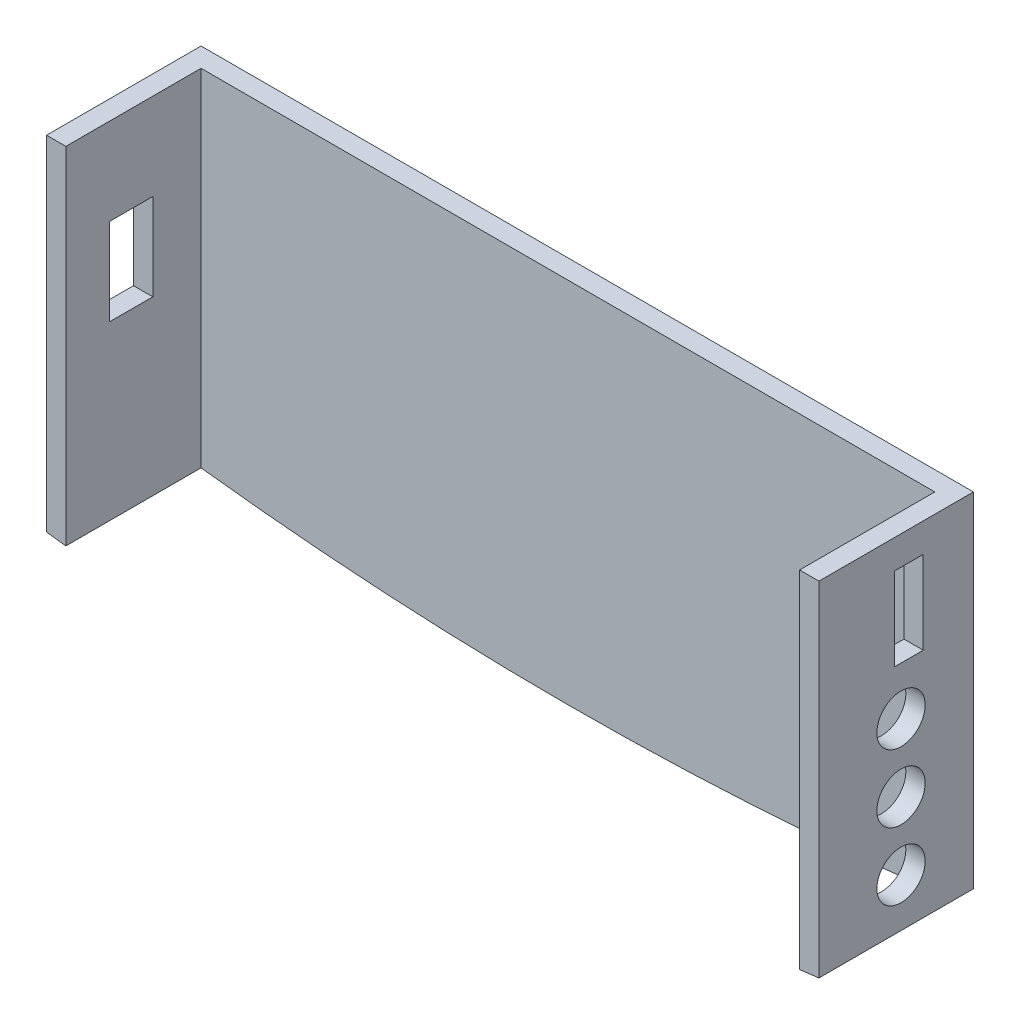
ISO-10303-21;
HEADER;
FILE_DESCRIPTION(('STEP AP214'),'2;1');
FILE_NAME('part.step','',(''),(''),'','','');
FILE_SCHEMA(('AUTOMOTIVE_DESIGN { 1 0 10303 214 1 1 1 1 }'));
ENDSEC;
DATA;
#1=APPLICATION_CONTEXT('core data for automotive mechanical design processes');
#2=APPLICATION_PROTOCOL_DEFINITION('international standard','automotive_design',2000,#1);
#3=PRODUCT_CONTEXT('',#1,'mechanical');
#4=PRODUCT('Part','Part','',(#3));
#5=PRODUCT_RELATED_PRODUCT_CATEGORY('part','',(#4));
#6=PRODUCT_DEFINITION_FORMATION('','',#4);
#7=PRODUCT_DEFINITION_CONTEXT('part definition',#1,'design');
#8=PRODUCT_DEFINITION('design','',#6,#7);
#9=PRODUCT_DEFINITION_SHAPE('','',#8);
#10=(LENGTH_UNIT() NAMED_UNIT(*) SI_UNIT(.MILLI.,.METRE.));
#11=(NAMED_UNIT(*) PLANE_ANGLE_UNIT() SI_UNIT($,.RADIAN.));
#12=(NAMED_UNIT(*) SI_UNIT($,.STERADIAN.) SOLID_ANGLE_UNIT());
#13=UNCERTAINTY_MEASURE_WITH_UNIT(LENGTH_MEASURE(1.E-05),#10,'distance_accuracy_value','');
#14=(GEOMETRIC_REPRESENTATION_CONTEXT(3) GLOBAL_UNCERTAINTY_ASSIGNED_CONTEXT((#13)) GLOBAL_UNIT_ASSIGNED_CONTEXT((#10,
#11,#12)) REPRESENTATION_CONTEXT('',''));
#15=CARTESIAN_POINT('',(0.,0.,0.));
#16=DIRECTION('',(0.,0.,1.));
#17=DIRECTION('',(1.,0.,0.));
#18=AXIS2_PLACEMENT_3D('',#15,#16,#17);
#19=CARTESIAN_POINT('',(0.,0.,16.));
#20=DIRECTION('',(0.,0.,1.));
#21=DIRECTION('',(1.,0.,0.));
#22=AXIS2_PLACEMENT_3D('',#19,#20,#21);
#23=PLANE('',#22);
#24=CARTESIAN_POINT('',(-50.4205664671253,289.986586920608,16.));
#25=DIRECTION('',(0.,0.,1.));
#26=DIRECTION('',(1.,0.,0.));
#27=AXIS2_PLACEMENT_3D('',#24,#25,#26);
#28=CIRCLE('',#27,321.75);
#29=CARTESIAN_POINT('',(-90.4205664671254,-29.2673284821631,16.));
#30=VERTEX_POINT('',#29);
#31=CARTESIAN_POINT('',(-88.4205664671254,-29.5115547015299,16.));
#32=VERTEX_POINT('',#31);
#33=EDGE_CURVE('E318',#30,#32,#28,.T.);
#34=ORIENTED_EDGE('',*,*,#33,.T.);
#35=DIRECTION('',(0.,1.,0.));
#36=VECTOR('',#35,1.);
#37=CARTESIAN_POINT('',(-88.4205664671254,0.,16.));
#38=LINE('',#37,#36);
#39=CARTESIAN_POINT('',(-88.4205664671254,6.33267151783695,16.));
#40=VERTEX_POINT('',#39);
#41=EDGE_CURVE('E300',#32,#40,#38,.T.);
#42=ORIENTED_EDGE('',*,*,#41,.T.);
#43=DIRECTION('',(-1.,0.,0.));
#44=VECTOR('',#43,1.);
#45=CARTESIAN_POINT('',(0.,6.33267151783695,16.));
#46=LINE('',#45,#44);
#47=CARTESIAN_POINT('',(-90.4205664671254,6.33267151783695,16.));
#48=VERTEX_POINT('',#47);
#49=EDGE_CURVE('E325',#40,#48,#46,.T.);
#50=ORIENTED_EDGE('',*,*,#49,.T.);
#51=DIRECTION('',(0.,1.,0.));
#52=VECTOR('',#51,1.);
#53=CARTESIAN_POINT('',(-90.4205664671254,0.,16.));
#54=LINE('',#53,#52);
#55=EDGE_CURVE('E312',#30,#48,#54,.T.);
#56=ORIENTED_EDGE('',*,*,#55,.F.);
#57=EDGE_LOOP('',(#34,#42,#50,#56));
#58=FACE_BOUND('',#57,.T.);
#59=ADVANCED_FACE('F49',(#58),#23,.T.);
#60=CARTESIAN_POINT('',(-90.4205664671254,0.,16.));
#61=DIRECTION('',(-1.,0.,0.));
#62=DIRECTION('',(0.,0.,1.));
#63=AXIS2_PLACEMENT_3D('',#60,#61,#62);
#64=PLANE('',#63);
#65=DIRECTION('',(0.,-1.,0.));
#66=VECTOR('',#65,1.);
#67=CARTESIAN_POINT('',(-90.4205664671254,-2.66732848216305,7.));
#68=LINE('',#67,#66);
#69=CARTESIAN_POINT('',(-90.4205664671254,-2.66732848216305,7.));
#70=VERTEX_POINT('',#69);
#71=CARTESIAN_POINT('',(-90.4205664671254,-11.6673284821631,7.));
#72=VERTEX_POINT('',#71);
#73=EDGE_CURVE('E245',#70,#72,#68,.T.);
#74=ORIENTED_EDGE('',*,*,#73,.F.);
#75=DIRECTION('',(0.,0.,-1.));
#76=VECTOR('',#75,1.);
#77=CARTESIAN_POINT('',(-90.4205664671254,-2.66732848216305,7.));
#78=LINE('',#77,#76);
#79=CARTESIAN_POINT('',(-90.4205664671254,-2.66732848216305,11.5));
#80=VERTEX_POINT('',#79);
#81=EDGE_CURVE('E256',#80,#70,#78,.T.);
#82=ORIENTED_EDGE('',*,*,#81,.F.);
#83=DIRECTION('',(0.,1.,0.));
#84=VECTOR('',#83,1.);
#85=CARTESIAN_POINT('',(-90.4205664671254,-2.66732848216305,11.5));
#86=LINE('',#85,#84);
#87=CARTESIAN_POINT('',(-90.4205664671254,-11.6673284821631,11.5));
#88=VERTEX_POINT('',#87);
#89=EDGE_CURVE('E252',#88,#80,#86,.T.);
#90=ORIENTED_EDGE('',*,*,#89,.F.);
#91=DIRECTION('',(0.,0.,1.));
#92=VECTOR('',#91,1.);
#93=CARTESIAN_POINT('',(-90.4205664671254,-11.6673284821631,7.));
#94=LINE('',#93,#92);
#95=EDGE_CURVE('E248',#72,#88,#94,.T.);
#96=ORIENTED_EDGE('',*,*,#95,.F.);
#97=EDGE_LOOP('',(#74,#82,#90,#96));
#98=FACE_BOUND('',#97,.T.);
#99=DIRECTION('',(0.,1.,0.));
#100=VECTOR('',#99,1.);
#101=CARTESIAN_POINT('',(-90.4205664671254,0.,0.));
#102=LINE('',#101,#100);
#103=CARTESIAN_POINT('',(-90.4205664671254,-29.2673284821631,0.));
#104=VERTEX_POINT('',#103);
#105=CARTESIAN_POINT('',(-90.4205664671254,6.33267151783695,0.));
#106=VERTEX_POINT('',#105);
#107=EDGE_CURVE('E288',#104,#106,#102,.T.);
#108=ORIENTED_EDGE('',*,*,#107,.F.);
#109=DIRECTION('',(0.,0.,-1.));
#110=VECTOR('',#109,1.);
#111=CARTESIAN_POINT('',(-90.4205664671254,-29.2673284821631,16.));
#112=LINE('',#111,#110);
#113=EDGE_CURVE('E11',#30,#104,#112,.T.);
#114=ORIENTED_EDGE('',*,*,#113,.F.);
#115=ORIENTED_EDGE('',*,*,#55,.T.);
#116=DIRECTION('',(0.,0.,-1.));
#117=VECTOR('',#116,1.);
#118=CARTESIAN_POINT('',(-90.4205664671254,6.33267151783695,16.));
#119=LINE('',#118,#117);
#120=EDGE_CURVE('E330',#48,#106,#119,.T.);
#121=ORIENTED_EDGE('',*,*,#120,.T.);
#122=EDGE_LOOP('',(#108,#114,#115,#121));
#123=FACE_BOUND('',#122,.T.);
#124=ADVANCED_FACE('F51',(#98,#123),#64,.T.);
#125=CARTESIAN_POINT('',(-50.4205664671253,289.986586920608,16.));
#126=DIRECTION('',(0.,0.,-1.));
#127=DIRECTION('',(-1.,0.,0.));
#128=AXIS2_PLACEMENT_3D('',#125,#126,#127);
#129=CYLINDRICAL_SURFACE('',#128,321.75);
#130=CARTESIAN_POINT('',(-12.4205664671254,-29.5115547015299,16.));
#131=VERTEX_POINT('',#130);
#132=CARTESIAN_POINT('',(-10.4205664671254,-29.2673284821631,16.));
#133=VERTEX_POINT('',#132);
#134=EDGE_CURVE('E316',#131,#133,#28,.T.);
#135=ORIENTED_EDGE('',*,*,#134,.F.);
#136=DIRECTION('',(0.,0.,-1.));
#137=VECTOR('',#136,1.);
#138=CARTESIAN_POINT('',(-12.4205664671254,-29.5115547015299,16.));
#139=LINE('',#138,#137);
#140=CARTESIAN_POINT('',(-12.4205664671254,-29.51155470153,2.));
#141=VERTEX_POINT('',#140);
#142=EDGE_CURVE('E289',#131,#141,#139,.T.);
#143=ORIENTED_EDGE('',*,*,#142,.T.);
#144=CARTESIAN_POINT('',(-50.4205664671253,289.986586920608,2.));
#145=DIRECTION('',(0.,0.,1.));
#146=DIRECTION('',(1.,0.,0.));
#147=AXIS2_PLACEMENT_3D('',#144,#145,#146);
#148=CIRCLE('',#147,321.75);
#149=CARTESIAN_POINT('',(-88.4205664671254,-29.51155470153,2.));
#150=VERTEX_POINT('',#149);
#151=EDGE_CURVE('E281',#150,#141,#148,.T.);
#152=ORIENTED_EDGE('',*,*,#151,.F.);
#153=DIRECTION('',(0.,0.,-1.));
#154=VECTOR('',#153,1.);
#155=CARTESIAN_POINT('',(-88.4205664671254,-29.5115547015299,16.));
#156=LINE('',#155,#154);
#157=EDGE_CURVE('E286',#32,#150,#156,.T.);
#158=ORIENTED_EDGE('',*,*,#157,.F.);
#159=ORIENTED_EDGE('',*,*,#33,.F.);
#160=ORIENTED_EDGE('',*,*,#113,.T.);
#161=CARTESIAN_POINT('',(-50.4205664671253,289.986586920608,0.));
#162=DIRECTION('',(0.,0.,1.));
#163=DIRECTION('',(1.,0.,0.));
#164=AXIS2_PLACEMENT_3D('',#161,#162,#163);
#165=CIRCLE('',#164,321.75);
#166=CARTESIAN_POINT('',(-10.4205664671254,-29.2673284821631,0.));
#167=VERTEX_POINT('',#166);
#168=EDGE_CURVE('E334',#104,#167,#165,.T.);
#169=ORIENTED_EDGE('',*,*,#168,.T.);
#170=DIRECTION('',(0.,0.,-1.));
#171=VECTOR('',#170,1.);
#172=CARTESIAN_POINT('',(-10.4205664671254,-29.2673284821631,16.));
#173=LINE('',#172,#171);
#174=EDGE_CURVE('E58',#133,#167,#173,.T.);
#175=ORIENTED_EDGE('',*,*,#174,.F.);
#176=EDGE_LOOP('',(#135,#143,#152,#158,#159,#160,#169,#175));
#177=FACE_BOUND('',#176,.T.);
#178=ADVANCED_FACE('F438',(#177),#129,.T.);
#179=CARTESIAN_POINT('',(-10.4205664671254,0.,16.));
#180=DIRECTION('',(-1.,0.,0.));
#181=DIRECTION('',(0.,0.,1.));
#182=AXIS2_PLACEMENT_3D('',#179,#180,#181);
#183=PLANE('',#182);
#184=DIRECTION('',(0.,0.,-1.));
#185=VECTOR('',#184,1.);
#186=CARTESIAN_POINT('',(-10.4205664671254,-5.26732848216305,8.2));
#187=LINE('',#186,#185);
#188=CARTESIAN_POINT('',(-10.4205664671254,-5.26732848216305,8.2));
#189=VERTEX_POINT('',#188);
#190=CARTESIAN_POINT('',(-10.4205664671254,-5.26732848216305,5.2));
#191=VERTEX_POINT('',#190);
#192=EDGE_CURVE('E65',#189,#191,#187,.T.);
#193=ORIENTED_EDGE('',*,*,#192,.F.);
#194=DIRECTION('',(0.,-1.,0.));
#195=VECTOR('',#194,1.);
#196=CARTESIAN_POINT('',(-10.4205664671254,3.33267151783695,8.2));
#197=LINE('',#196,#195);
#198=CARTESIAN_POINT('',(-10.4205664671254,3.33267151783695,8.2));
#199=VERTEX_POINT('',#198);
#200=EDGE_CURVE('E200',#199,#189,#197,.T.);
#201=ORIENTED_EDGE('',*,*,#200,.F.);
#202=DIRECTION('',(0.,0.,1.));
#203=VECTOR('',#202,1.);
#204=CARTESIAN_POINT('',(-10.4205664671254,3.33267151783695,8.2));
#205=LINE('',#204,#203);
#206=CARTESIAN_POINT('',(-10.4205664671254,3.33267151783695,5.2));
#207=VERTEX_POINT('',#206);
#208=EDGE_CURVE('E190',#207,#199,#205,.T.);
#209=ORIENTED_EDGE('',*,*,#208,.F.);
#210=DIRECTION('',(0.,1.,0.));
#211=VECTOR('',#210,1.);
#212=CARTESIAN_POINT('',(-10.4205664671254,3.33267151783695,5.2));
#213=LINE('',#212,#211);
#214=EDGE_CURVE('E195',#191,#207,#213,.T.);
#215=ORIENTED_EDGE('',*,*,#214,.F.);
#216=EDGE_LOOP('',(#193,#201,#209,#215));
#217=FACE_BOUND('',#216,.T.);
#218=CARTESIAN_POINT('',(-10.4205664671254,-10.2673284821631,7.5));
#219=DIRECTION('',(1.,0.,0.));
#220=DIRECTION('',(0.,0.,-1.));
#221=AXIS2_PLACEMENT_3D('',#218,#219,#220);
#222=CIRCLE('',#221,2.5);
#223=CARTESIAN_POINT('',(-10.4205664671254,-10.2673284821631,5.));
#224=VERTEX_POINT('',#223);
#225=EDGE_CURVE('E213',#224,#224,#222,.T.);
#226=ORIENTED_EDGE('',*,*,#225,.F.);
#227=EDGE_LOOP('',(#226));
#228=FACE_BOUND('',#227,.T.);
#229=CARTESIAN_POINT('',(-10.4205664671254,-17.2673284821631,7.5));
#230=DIRECTION('',(1.,0.,0.));
#231=DIRECTION('',(0.,0.,-1.));
#232=AXIS2_PLACEMENT_3D('',#229,#230,#231);
#233=CIRCLE('',#232,2.5);
#234=CARTESIAN_POINT('',(-10.4205664671254,-17.2673284821631,5.));
#235=VERTEX_POINT('',#234);
#236=EDGE_CURVE('E217',#235,#235,#233,.T.);
#237=ORIENTED_EDGE('',*,*,#236,.F.);
#238=EDGE_LOOP('',(#237));
#239=FACE_BOUND('',#238,.T.);
#240=CARTESIAN_POINT('',(-10.4205664671254,-24.2673284821631,7.5));
#241=DIRECTION('',(1.,0.,0.));
#242=DIRECTION('',(0.,0.,-1.));
#243=AXIS2_PLACEMENT_3D('',#240,#241,#242);
#244=CIRCLE('',#243,2.5);
#245=CARTESIAN_POINT('',(-10.4205664671254,-24.2673284821631,5.));
#246=VERTEX_POINT('',#245);
#247=EDGE_CURVE('E228',#246,#246,#244,.T.);
#248=ORIENTED_EDGE('',*,*,#247,.F.);
#249=EDGE_LOOP('',(#248));
#250=FACE_BOUND('',#249,.T.);
#251=DIRECTION('',(0.,1.,0.));
#252=VECTOR('',#251,1.);
#253=CARTESIAN_POINT('',(-10.4205664671254,0.,0.));
#254=LINE('',#253,#252);
#255=CARTESIAN_POINT('',(-10.4205664671254,6.33267151783695,0.));
#256=VERTEX_POINT('',#255);
#257=EDGE_CURVE('E337',#167,#256,#254,.T.);
#258=ORIENTED_EDGE('',*,*,#257,.T.);
#259=DIRECTION('',(0.,0.,-1.));
#260=VECTOR('',#259,1.);
#261=CARTESIAN_POINT('',(-10.4205664671254,6.33267151783695,16.));
#262=LINE('',#261,#260);
#263=CARTESIAN_POINT('',(-10.4205664671254,6.33267151783695,16.));
#264=VERTEX_POINT('',#263);
#265=EDGE_CURVE('E345',#264,#256,#262,.T.);
#266=ORIENTED_EDGE('',*,*,#265,.F.);
#267=DIRECTION('',(0.,1.,0.));
#268=VECTOR('',#267,1.);
#269=CARTESIAN_POINT('',(-10.4205664671254,0.,16.));
#270=LINE('',#269,#268);
#271=EDGE_CURVE('E322',#133,#264,#270,.T.);
#272=ORIENTED_EDGE('',*,*,#271,.F.);
#273=ORIENTED_EDGE('',*,*,#174,.T.);
#274=EDGE_LOOP('',(#258,#266,#272,#273));
#275=FACE_BOUND('',#274,.T.);
#276=ADVANCED_FACE('F355',(#217,#228,#239,#250,#275),#183,.F.);
#277=CARTESIAN_POINT('',(0.,6.33267151783695,16.));
#278=DIRECTION('',(0.,-1.,0.));
#279=DIRECTION('',(0.,0.,-1.));
#280=AXIS2_PLACEMENT_3D('',#277,#278,#279);
#281=PLANE('',#280);
#282=ORIENTED_EDGE('',*,*,#49,.F.);
#283=DIRECTION('',(0.,0.,-1.));
#284=VECTOR('',#283,1.);
#285=CARTESIAN_POINT('',(-88.4205664671254,6.33267151783695,16.));
#286=LINE('',#285,#284);
#287=CARTESIAN_POINT('',(-88.4205664671254,6.33267151783695,2.));
#288=VERTEX_POINT('',#287);
#289=EDGE_CURVE('E299',#40,#288,#286,.T.);
#290=ORIENTED_EDGE('',*,*,#289,.T.);
#291=DIRECTION('',(-1.,0.,0.));
#292=VECTOR('',#291,1.);
#293=CARTESIAN_POINT('',(0.,6.33267151783695,2.));
#294=LINE('',#293,#292);
#295=CARTESIAN_POINT('',(-12.4205664671254,6.33267151783695,2.));
#296=VERTEX_POINT('',#295);
#297=EDGE_CURVE('E285',#296,#288,#294,.T.);
#298=ORIENTED_EDGE('',*,*,#297,.F.);
#299=DIRECTION('',(0.,0.,-1.));
#300=VECTOR('',#299,1.);
#301=CARTESIAN_POINT('',(-12.4205664671254,6.33267151783695,16.));
#302=LINE('',#301,#300);
#303=CARTESIAN_POINT('',(-12.4205664671254,6.33267151783695,16.));
#304=VERTEX_POINT('',#303);
#305=EDGE_CURVE('E295',#304,#296,#302,.T.);
#306=ORIENTED_EDGE('',*,*,#305,.F.);
#307=EDGE_CURVE('E326',#264,#304,#46,.T.);
#308=ORIENTED_EDGE('',*,*,#307,.F.);
#309=ORIENTED_EDGE('',*,*,#265,.T.);
#310=DIRECTION('',(-1.,0.,0.));
#311=VECTOR('',#310,1.);
#312=CARTESIAN_POINT('',(0.,6.33267151783695,0.));
#313=LINE('',#312,#311);
#314=EDGE_CURVE('E317',#256,#106,#313,.T.);
#315=ORIENTED_EDGE('',*,*,#314,.T.);
#316=ORIENTED_EDGE('',*,*,#120,.F.);
#317=EDGE_LOOP('',(#282,#290,#298,#306,#308,#309,#315,#316));
#318=FACE_BOUND('',#317,.T.);
#319=ADVANCED_FACE('F367',(#318),#281,.F.);
#320=DIRECTION('',(0.,1.,0.));
#321=VECTOR('',#320,1.);
#322=CARTESIAN_POINT('',(-12.4205664671254,0.,16.));
#323=LINE('',#322,#321);
#324=EDGE_CURVE('E296',#131,#304,#323,.T.);
#325=ORIENTED_EDGE('',*,*,#324,.F.);
#326=ORIENTED_EDGE('',*,*,#134,.T.);
#327=ORIENTED_EDGE('',*,*,#271,.T.);
#328=ORIENTED_EDGE('',*,*,#307,.T.);
#329=EDGE_LOOP('',(#325,#326,#327,#328));
#330=FACE_BOUND('',#329,.T.);
#331=ADVANCED_FACE('F373',(#330),#23,.T.);
#332=CARTESIAN_POINT('',(0.,0.,0.));
#333=DIRECTION('',(0.,0.,1.));
#334=DIRECTION('',(1.,0.,0.));
#335=AXIS2_PLACEMENT_3D('',#332,#333,#334);
#336=PLANE('',#335);
#337=ORIENTED_EDGE('',*,*,#107,.T.);
#338=ORIENTED_EDGE('',*,*,#314,.F.);
#339=ORIENTED_EDGE('',*,*,#257,.F.);
#340=ORIENTED_EDGE('',*,*,#168,.F.);
#341=EDGE_LOOP('',(#337,#338,#339,#340));
#342=FACE_BOUND('',#341,.T.);
#343=ADVANCED_FACE('F362',(#342),#336,.F.);
#344=CARTESIAN_POINT('',(-88.4205664671254,0.,16.));
#345=DIRECTION('',(-1.,0.,0.));
#346=DIRECTION('',(0.,0.,1.));
#347=AXIS2_PLACEMENT_3D('',#344,#345,#346);
#348=PLANE('',#347);
#349=DIRECTION('',(0.,0.,1.));
#350=VECTOR('',#349,1.);
#351=CARTESIAN_POINT('',(-88.4205664671254,-2.66732848216305,7.));
#352=LINE('',#351,#350);
#353=CARTESIAN_POINT('',(-88.4205664671254,-2.66732848216305,7.));
#354=VERTEX_POINT('',#353);
#355=CARTESIAN_POINT('',(-88.4205664671254,-2.66732848216305,11.5));
#356=VERTEX_POINT('',#355);
#357=EDGE_CURVE('E238',#354,#356,#352,.T.);
#358=ORIENTED_EDGE('',*,*,#357,.F.);
#359=DIRECTION('',(0.,1.,0.));
#360=VECTOR('',#359,1.);
#361=CARTESIAN_POINT('',(-88.4205664671254,-2.66732848216305,7.));
#362=LINE('',#361,#360);
#363=CARTESIAN_POINT('',(-88.4205664671254,-11.6673284821631,7.));
#364=VERTEX_POINT('',#363);
#365=EDGE_CURVE('E241',#364,#354,#362,.T.);
#366=ORIENTED_EDGE('',*,*,#365,.F.);
#367=DIRECTION('',(0.,0.,-1.));
#368=VECTOR('',#367,1.);
#369=CARTESIAN_POINT('',(-88.4205664671254,-11.6673284821631,7.));
#370=LINE('',#369,#368);
#371=CARTESIAN_POINT('',(-88.4205664671254,-11.6673284821631,11.5));
#372=VERTEX_POINT('',#371);
#373=EDGE_CURVE('E264',#372,#364,#370,.T.);
#374=ORIENTED_EDGE('',*,*,#373,.F.);
#375=DIRECTION('',(0.,-1.,0.));
#376=VECTOR('',#375,1.);
#377=CARTESIAN_POINT('',(-88.4205664671254,-2.66732848216305,11.5));
#378=LINE('',#377,#376);
#379=EDGE_CURVE('E194',#356,#372,#378,.T.);
#380=ORIENTED_EDGE('',*,*,#379,.F.);
#381=EDGE_LOOP('',(#358,#366,#374,#380));
#382=FACE_BOUND('',#381,.T.);
#383=DIRECTION('',(0.,1.,0.));
#384=VECTOR('',#383,1.);
#385=CARTESIAN_POINT('',(-88.4205664671254,0.,2.));
#386=LINE('',#385,#384);
#387=EDGE_CURVE('E277',#150,#288,#386,.T.);
#388=ORIENTED_EDGE('',*,*,#387,.T.);
#389=ORIENTED_EDGE('',*,*,#289,.F.);
#390=ORIENTED_EDGE('',*,*,#41,.F.);
#391=ORIENTED_EDGE('',*,*,#157,.T.);
#392=EDGE_LOOP('',(#388,#389,#390,#391));
#393=FACE_BOUND('',#392,.T.);
#394=ADVANCED_FACE('F431',(#382,#393),#348,.F.);
#395=CARTESIAN_POINT('',(-12.4205664671254,0.,16.));
#396=DIRECTION('',(-1.,0.,0.));
#397=DIRECTION('',(0.,0.,1.));
#398=AXIS2_PLACEMENT_3D('',#395,#396,#397);
#399=PLANE('',#398);
#400=DIRECTION('',(0.,-1.,0.));
#401=VECTOR('',#400,1.);
#402=CARTESIAN_POINT('',(-12.4205664671254,3.33267151783695,8.2));
#403=LINE('',#402,#401);
#404=CARTESIAN_POINT('',(-12.4205664671254,3.33267151783695,8.2));
#405=VERTEX_POINT('',#404);
#406=CARTESIAN_POINT('',(-12.4205664671254,-5.26732848216305,8.2));
#407=VERTEX_POINT('',#406);
#408=EDGE_CURVE('E180',#405,#407,#403,.T.);
#409=ORIENTED_EDGE('',*,*,#408,.T.);
#410=DIRECTION('',(0.,0.,-1.));
#411=VECTOR('',#410,1.);
#412=CARTESIAN_POINT('',(-12.4205664671254,-5.26732848216305,8.2));
#413=LINE('',#412,#411);
#414=CARTESIAN_POINT('',(-12.4205664671254,-5.26732848216305,5.2));
#415=VERTEX_POINT('',#414);
#416=EDGE_CURVE('E172',#407,#415,#413,.T.);
#417=ORIENTED_EDGE('',*,*,#416,.T.);
#418=DIRECTION('',(0.,1.,0.));
#419=VECTOR('',#418,1.);
#420=CARTESIAN_POINT('',(-12.4205664671254,3.33267151783695,5.2));
#421=LINE('',#420,#419);
#422=CARTESIAN_POINT('',(-12.4205664671254,3.33267151783695,5.2));
#423=VERTEX_POINT('',#422);
#424=EDGE_CURVE('E161',#415,#423,#421,.T.);
#425=ORIENTED_EDGE('',*,*,#424,.T.);
#426=DIRECTION('',(0.,0.,1.));
#427=VECTOR('',#426,1.);
#428=CARTESIAN_POINT('',(-12.4205664671254,3.33267151783695,8.2));
#429=LINE('',#428,#427);
#430=EDGE_CURVE('E175',#423,#405,#429,.T.);
#431=ORIENTED_EDGE('',*,*,#430,.T.);
#432=EDGE_LOOP('',(#409,#417,#425,#431));
#433=FACE_BOUND('',#432,.T.);
#434=CARTESIAN_POINT('',(-12.4205664671254,-10.2673284821631,7.5));
#435=DIRECTION('',(-1.,0.,0.));
#436=DIRECTION('',(0.,0.,1.));
#437=AXIS2_PLACEMENT_3D('',#434,#435,#436);
#438=CIRCLE('',#437,2.5);
#439=CARTESIAN_POINT('',(-12.4205664671254,-10.2673284821631,10.));
#440=VERTEX_POINT('',#439);
#441=EDGE_CURVE('E206',#440,#440,#438,.F.);
#442=ORIENTED_EDGE('',*,*,#441,.T.);
#443=EDGE_LOOP('',(#442));
#444=FACE_BOUND('',#443,.T.);
#445=CARTESIAN_POINT('',(-12.4205664671254,-17.2673284821631,7.5));
#446=DIRECTION('',(-1.,0.,0.));
#447=DIRECTION('',(0.,0.,1.));
#448=AXIS2_PLACEMENT_3D('',#445,#446,#447);
#449=CIRCLE('',#448,2.5);
#450=CARTESIAN_POINT('',(-12.4205664671254,-17.2673284821631,10.));
#451=VERTEX_POINT('',#450);
#452=EDGE_CURVE('E224',#451,#451,#449,.F.);
#453=ORIENTED_EDGE('',*,*,#452,.T.);
#454=EDGE_LOOP('',(#453));
#455=FACE_BOUND('',#454,.T.);
#456=CARTESIAN_POINT('',(-12.4205664671254,-24.2673284821631,7.5));
#457=DIRECTION('',(-1.,0.,0.));
#458=DIRECTION('',(0.,0.,1.));
#459=AXIS2_PLACEMENT_3D('',#456,#457,#458);
#460=CIRCLE('',#459,2.5);
#461=CARTESIAN_POINT('',(-12.4205664671254,-24.2673284821631,10.));
#462=VERTEX_POINT('',#461);
#463=EDGE_CURVE('E232',#462,#462,#460,.F.);
#464=ORIENTED_EDGE('',*,*,#463,.T.);
#465=EDGE_LOOP('',(#464));
#466=FACE_BOUND('',#465,.T.);
#467=DIRECTION('',(0.,1.,0.));
#468=VECTOR('',#467,1.);
#469=CARTESIAN_POINT('',(-12.4205664671254,0.,2.));
#470=LINE('',#469,#468);
#471=EDGE_CURVE('E282',#141,#296,#470,.T.);
#472=ORIENTED_EDGE('',*,*,#471,.F.);
#473=ORIENTED_EDGE('',*,*,#142,.F.);
#474=ORIENTED_EDGE('',*,*,#324,.T.);
#475=ORIENTED_EDGE('',*,*,#305,.T.);
#476=EDGE_LOOP('',(#472,#473,#474,#475));
#477=FACE_BOUND('',#476,.T.);
#478=ADVANCED_FACE('F178',(#433,#444,#455,#466,#477),#399,.T.);
#479=CARTESIAN_POINT('',(0.,0.,2.));
#480=DIRECTION('',(0.,0.,1.));
#481=DIRECTION('',(1.,0.,0.));
#482=AXIS2_PLACEMENT_3D('',#479,#480,#481);
#483=PLANE('',#482);
#484=ORIENTED_EDGE('',*,*,#387,.F.);
#485=ORIENTED_EDGE('',*,*,#151,.T.);
#486=ORIENTED_EDGE('',*,*,#471,.T.);
#487=ORIENTED_EDGE('',*,*,#297,.T.);
#488=EDGE_LOOP('',(#484,#485,#486,#487));
#489=FACE_BOUND('',#488,.T.);
#490=ADVANCED_FACE('F436',(#489),#483,.T.);
#491=CARTESIAN_POINT('',(-10.4195664671254,-2.66732848216305,7.));
#492=DIRECTION('',(0.,0.,-1.));
#493=DIRECTION('',(0.,1.,0.));
#494=AXIS2_PLACEMENT_3D('',#491,#492,#493);
#495=PLANE('',#494);
#496=ORIENTED_EDGE('',*,*,#365,.T.);
#497=DIRECTION('',(-1.,0.,0.));
#498=VECTOR('',#497,1.);
#499=CARTESIAN_POINT('',(-10.4195664671254,-2.66732848216305,7.));
#500=LINE('',#499,#498);
#501=EDGE_CURVE('E261',#354,#70,#500,.T.);
#502=ORIENTED_EDGE('',*,*,#501,.T.);
#503=ORIENTED_EDGE('',*,*,#73,.T.);
#504=DIRECTION('',(-1.,0.,0.));
#505=VECTOR('',#504,1.);
#506=CARTESIAN_POINT('',(-10.4195664671254,-11.6673284821631,7.));
#507=LINE('',#506,#505);
#508=EDGE_CURVE('E260',#364,#72,#507,.T.);
#509=ORIENTED_EDGE('',*,*,#508,.F.);
#510=EDGE_LOOP('',(#496,#502,#503,#509));
#511=FACE_BOUND('',#510,.T.);
#512=ADVANCED_FACE('F447',(#511),#495,.F.);
#513=CARTESIAN_POINT('',(-10.4195664671254,-2.66732848216305,7.));
#514=DIRECTION('',(0.,1.,0.));
#515=DIRECTION('',(0.,0.,1.));
#516=AXIS2_PLACEMENT_3D('',#513,#514,#515);
#517=PLANE('',#516);
#518=ORIENTED_EDGE('',*,*,#357,.T.);
#519=DIRECTION('',(-1.,0.,0.));
#520=VECTOR('',#519,1.);
#521=CARTESIAN_POINT('',(-10.4195664671254,-2.66732848216305,11.5));
#522=LINE('',#521,#520);
#523=EDGE_CURVE('E265',#356,#80,#522,.T.);
#524=ORIENTED_EDGE('',*,*,#523,.T.);
#525=ORIENTED_EDGE('',*,*,#81,.T.);
#526=ORIENTED_EDGE('',*,*,#501,.F.);
#527=EDGE_LOOP('',(#518,#524,#525,#526));
#528=FACE_BOUND('',#527,.T.);
#529=ADVANCED_FACE('F512',(#528),#517,.F.);
#530=CARTESIAN_POINT('',(-10.4195664671254,-2.66732848216305,11.5));
#531=DIRECTION('',(0.,0.,1.));
#532=DIRECTION('',(0.,-1.,0.));
#533=AXIS2_PLACEMENT_3D('',#530,#531,#532);
#534=PLANE('',#533);
#535=ORIENTED_EDGE('',*,*,#379,.T.);
#536=DIRECTION('',(-1.,0.,0.));
#537=VECTOR('',#536,1.);
#538=CARTESIAN_POINT('',(-10.4195664671254,-11.6673284821631,11.5));
#539=LINE('',#538,#537);
#540=EDGE_CURVE('E268',#372,#88,#539,.T.);
#541=ORIENTED_EDGE('',*,*,#540,.T.);
#542=ORIENTED_EDGE('',*,*,#89,.T.);
#543=ORIENTED_EDGE('',*,*,#523,.F.);
#544=EDGE_LOOP('',(#535,#541,#542,#543));
#545=FACE_BOUND('',#544,.T.);
#546=ADVANCED_FACE('F521',(#545),#534,.F.);
#547=CARTESIAN_POINT('',(-10.4195664671254,-11.6673284821631,7.));
#548=DIRECTION('',(0.,-1.,0.));
#549=DIRECTION('',(0.,0.,-1.));
#550=AXIS2_PLACEMENT_3D('',#547,#548,#549);
#551=PLANE('',#550);
#552=ORIENTED_EDGE('',*,*,#373,.T.);
#553=ORIENTED_EDGE('',*,*,#508,.T.);
#554=ORIENTED_EDGE('',*,*,#95,.T.);
#555=ORIENTED_EDGE('',*,*,#540,.F.);
#556=EDGE_LOOP('',(#552,#553,#554,#555));
#557=FACE_BOUND('',#556,.T.);
#558=ADVANCED_FACE('F530',(#557),#551,.F.);
#559=CARTESIAN_POINT('',(-90.4215664671254,-24.2673284821631,7.5));
#560=DIRECTION('',(1.,0.,0.));
#561=DIRECTION('',(0.,0.,-1.));
#562=AXIS2_PLACEMENT_3D('',#559,#560,#561);
#563=CYLINDRICAL_SURFACE('',#562,2.5);
#564=ORIENTED_EDGE('',*,*,#463,.F.);
#565=EDGE_LOOP('',(#564));
#566=FACE_BOUND('',#565,.T.);
#567=ORIENTED_EDGE('',*,*,#247,.T.);
#568=EDGE_LOOP('',(#567));
#569=FACE_BOUND('',#568,.T.);
#570=ADVANCED_FACE('F538',(#566,#569),#563,.F.);
#571=CARTESIAN_POINT('',(-90.4215664671254,-17.2673284821631,7.5));
#572=DIRECTION('',(1.,0.,0.));
#573=DIRECTION('',(0.,0.,-1.));
#574=AXIS2_PLACEMENT_3D('',#571,#572,#573);
#575=CYLINDRICAL_SURFACE('',#574,2.5);
#576=ORIENTED_EDGE('',*,*,#452,.F.);
#577=EDGE_LOOP('',(#576));
#578=FACE_BOUND('',#577,.T.);
#579=ORIENTED_EDGE('',*,*,#236,.T.);
#580=EDGE_LOOP('',(#579));
#581=FACE_BOUND('',#580,.T.);
#582=ADVANCED_FACE('F546',(#578,#581),#575,.F.);
#583=CARTESIAN_POINT('',(-90.4215664671254,-10.2673284821631,7.5));
#584=DIRECTION('',(1.,0.,0.));
#585=DIRECTION('',(0.,0.,-1.));
#586=AXIS2_PLACEMENT_3D('',#583,#584,#585);
#587=CYLINDRICAL_SURFACE('',#586,2.5);
#588=ORIENTED_EDGE('',*,*,#441,.F.);
#589=EDGE_LOOP('',(#588));
#590=FACE_BOUND('',#589,.T.);
#591=ORIENTED_EDGE('',*,*,#225,.T.);
#592=EDGE_LOOP('',(#591));
#593=FACE_BOUND('',#592,.T.);
#594=ADVANCED_FACE('F555',(#590,#593),#587,.F.);
#595=CARTESIAN_POINT('',(-90.4215664671254,3.33267151783695,8.2));
#596=DIRECTION('',(0.,0.,1.));
#597=DIRECTION('',(0.,-1.,0.));
#598=AXIS2_PLACEMENT_3D('',#595,#596,#597);
#599=PLANE('',#598);
#600=DIRECTION('',(1.,0.,0.));
#601=VECTOR('',#600,1.);
#602=CARTESIAN_POINT('',(-90.4215664671254,3.33267151783695,8.2));
#603=LINE('',#602,#601);
#604=EDGE_CURVE('E169',#405,#199,#603,.T.);
#605=ORIENTED_EDGE('',*,*,#604,.T.);
#606=ORIENTED_EDGE('',*,*,#200,.T.);
#607=DIRECTION('',(1.,0.,0.));
#608=VECTOR('',#607,1.);
#609=CARTESIAN_POINT('',(-90.4215664671254,-5.26732848216305,8.2));
#610=LINE('',#609,#608);
#611=EDGE_CURVE('E182',#407,#189,#610,.T.);
#612=ORIENTED_EDGE('',*,*,#611,.F.);
#613=ORIENTED_EDGE('',*,*,#408,.F.);
#614=EDGE_LOOP('',(#605,#606,#612,#613));
#615=FACE_BOUND('',#614,.T.);
#616=ADVANCED_FACE('F564',(#615),#599,.F.);
#617=CARTESIAN_POINT('',(-90.4215664671254,-5.26732848216305,8.2));
#618=DIRECTION('',(0.,-1.,0.));
#619=DIRECTION('',(0.,0.,-1.));
#620=AXIS2_PLACEMENT_3D('',#617,#618,#619);
#621=PLANE('',#620);
#622=ORIENTED_EDGE('',*,*,#611,.T.);
#623=ORIENTED_EDGE('',*,*,#192,.T.);
#624=DIRECTION('',(1.,0.,0.));
#625=VECTOR('',#624,1.);
#626=CARTESIAN_POINT('',(-90.4215664671254,-5.26732848216305,5.2));
#627=LINE('',#626,#625);
#628=EDGE_CURVE('E163',#415,#191,#627,.T.);
#629=ORIENTED_EDGE('',*,*,#628,.F.);
#630=ORIENTED_EDGE('',*,*,#416,.F.);
#631=EDGE_LOOP('',(#622,#623,#629,#630));
#632=FACE_BOUND('',#631,.T.);
#633=ADVANCED_FACE('F171',(#632),#621,.F.);
#634=CARTESIAN_POINT('',(-90.4215664671254,3.33267151783695,8.2));
#635=DIRECTION('',(0.,1.,0.));
#636=DIRECTION('',(0.,0.,1.));
#637=AXIS2_PLACEMENT_3D('',#634,#635,#636);
#638=PLANE('',#637);
#639=DIRECTION('',(1.,0.,0.));
#640=VECTOR('',#639,1.);
#641=CARTESIAN_POINT('',(-90.4215664671254,3.33267151783695,5.2));
#642=LINE('',#641,#640);
#643=EDGE_CURVE('E73',#423,#207,#642,.T.);
#644=ORIENTED_EDGE('',*,*,#643,.T.);
#645=ORIENTED_EDGE('',*,*,#208,.T.);
#646=ORIENTED_EDGE('',*,*,#604,.F.);
#647=ORIENTED_EDGE('',*,*,#430,.F.);
#648=EDGE_LOOP('',(#644,#645,#646,#647));
#649=FACE_BOUND('',#648,.T.);
#650=ADVANCED_FACE('F581',(#649),#638,.F.);
#651=CARTESIAN_POINT('',(-90.4215664671254,3.33267151783695,5.2));
#652=DIRECTION('',(0.,0.,-1.));
#653=DIRECTION('',(0.,1.,0.));
#654=AXIS2_PLACEMENT_3D('',#651,#652,#653);
#655=PLANE('',#654);
#656=ORIENTED_EDGE('',*,*,#628,.T.);
#657=ORIENTED_EDGE('',*,*,#214,.T.);
#658=ORIENTED_EDGE('',*,*,#643,.F.);
#659=ORIENTED_EDGE('',*,*,#424,.F.);
#660=EDGE_LOOP('',(#656,#657,#658,#659));
#661=FACE_BOUND('',#660,.T.);
#662=ADVANCED_FACE('F162',(#661),#655,.F.);
#663=CLOSED_SHELL('',(#59,#124,#178,#276,#319,#331,#343,#394,#478,#490,#512,#529,#546,#558,#570,
#582,#594,#616,#633,#650,#662));
#664=MANIFOLD_SOLID_BREP('B2',#663);
#665=ADVANCED_BREP_SHAPE_REPRESENTATION('',(#18,#664),#14);
#666=SHAPE_DEFINITION_REPRESENTATION(#9,#665);
ENDSEC;
END-ISO-10303-21;
